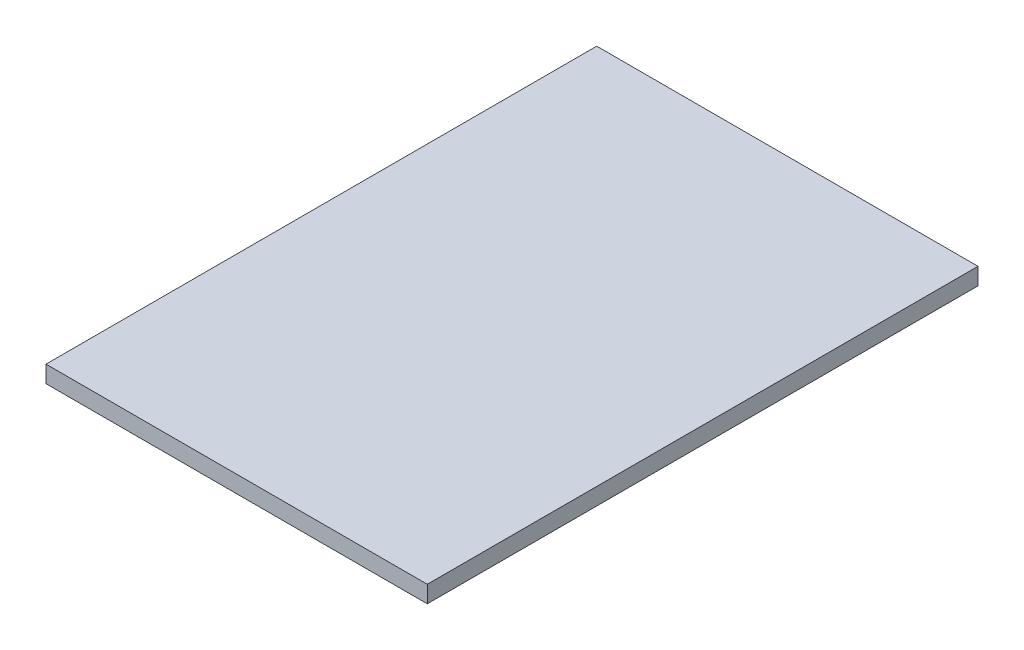
ISO-10303-21;
HEADER;
FILE_DESCRIPTION(('STEP AP214'),'2;1');
FILE_NAME('part.step','',(''),(''),'','','');
FILE_SCHEMA(('AUTOMOTIVE_DESIGN { 1 0 10303 214 1 1 1 1 }'));
ENDSEC;
DATA;
#1=APPLICATION_CONTEXT('core data for automotive mechanical design processes');
#2=APPLICATION_PROTOCOL_DEFINITION('international standard','automotive_design',2000,#1);
#3=PRODUCT_CONTEXT('',#1,'mechanical');
#4=PRODUCT('Part','Part','',(#3));
#5=PRODUCT_RELATED_PRODUCT_CATEGORY('part','',(#4));
#6=PRODUCT_DEFINITION_FORMATION('','',#4);
#7=PRODUCT_DEFINITION_CONTEXT('part definition',#1,'design');
#8=PRODUCT_DEFINITION('design','',#6,#7);
#9=PRODUCT_DEFINITION_SHAPE('','',#8);
#10=(LENGTH_UNIT() NAMED_UNIT(*) SI_UNIT(.MILLI.,.METRE.));
#11=(NAMED_UNIT(*) PLANE_ANGLE_UNIT() SI_UNIT($,.RADIAN.));
#12=(NAMED_UNIT(*) SI_UNIT($,.STERADIAN.) SOLID_ANGLE_UNIT());
#13=UNCERTAINTY_MEASURE_WITH_UNIT(LENGTH_MEASURE(1.E-05),#10,'distance_accuracy_value','');
#14=(GEOMETRIC_REPRESENTATION_CONTEXT(3) GLOBAL_UNCERTAINTY_ASSIGNED_CONTEXT((#13)) GLOBAL_UNIT_ASSIGNED_CONTEXT((#10,
#11,#12)) REPRESENTATION_CONTEXT('',''));
#15=CARTESIAN_POINT('',(0.,0.,0.));
#16=DIRECTION('',(0.,0.,1.));
#17=DIRECTION('',(1.,0.,0.));
#18=AXIS2_PLACEMENT_3D('',#15,#16,#17);
#19=CARTESIAN_POINT('',(225.,10.,325.));
#20=DIRECTION('',(-1.,0.,0.));
#21=DIRECTION('',(0.,0.,1.));
#22=AXIS2_PLACEMENT_3D('',#19,#20,#21);
#23=PLANE('',#22);
#24=DIRECTION('',(0.,0.,-1.));
#25=VECTOR('',#24,1.);
#26=CARTESIAN_POINT('',(225.,-10.,325.));
#27=LINE('',#26,#25);
#28=CARTESIAN_POINT('',(225.,-10.,325.));
#29=VERTEX_POINT('',#28);
#30=CARTESIAN_POINT('',(225.,-10.,-325.));
#31=VERTEX_POINT('',#30);
#32=EDGE_CURVE('E96',#29,#31,#27,.T.);
#33=ORIENTED_EDGE('',*,*,#32,.T.);
#34=DIRECTION('',(0.,-1.,0.));
#35=VECTOR('',#34,1.);
#36=CARTESIAN_POINT('',(225.,10.,-325.));
#37=LINE('',#36,#35);
#38=CARTESIAN_POINT('',(225.,10.,-325.));
#39=VERTEX_POINT('',#38);
#40=EDGE_CURVE('E11',#39,#31,#37,.T.);
#41=ORIENTED_EDGE('',*,*,#40,.F.);
#42=DIRECTION('',(0.,0.,-1.));
#43=VECTOR('',#42,1.);
#44=CARTESIAN_POINT('',(225.,10.,325.));
#45=LINE('',#44,#43);
#46=CARTESIAN_POINT('',(225.,10.,325.));
#47=VERTEX_POINT('',#46);
#48=EDGE_CURVE('E84',#47,#39,#45,.T.);
#49=ORIENTED_EDGE('',*,*,#48,.F.);
#50=DIRECTION('',(0.,-1.,0.));
#51=VECTOR('',#50,1.);
#52=CARTESIAN_POINT('',(225.,10.,325.));
#53=LINE('',#52,#51);
#54=EDGE_CURVE('E92',#47,#29,#53,.T.);
#55=ORIENTED_EDGE('',*,*,#54,.T.);
#56=EDGE_LOOP('',(#33,#41,#49,#55));
#57=FACE_BOUND('',#56,.T.);
#58=ADVANCED_FACE('F33',(#57),#23,.F.);
#59=CARTESIAN_POINT('',(-225.,10.,-325.));
#60=DIRECTION('',(0.,0.,1.));
#61=DIRECTION('',(1.,0.,0.));
#62=AXIS2_PLACEMENT_3D('',#59,#60,#61);
#63=PLANE('',#62);
#64=DIRECTION('',(-1.,0.,0.));
#65=VECTOR('',#64,1.);
#66=CARTESIAN_POINT('',(-225.,-10.,-325.));
#67=LINE('',#66,#65);
#68=CARTESIAN_POINT('',(-225.,-10.,-325.));
#69=VERTEX_POINT('',#68);
#70=EDGE_CURVE('E88',#31,#69,#67,.T.);
#71=ORIENTED_EDGE('',*,*,#70,.T.);
#72=DIRECTION('',(0.,-1.,0.));
#73=VECTOR('',#72,1.);
#74=CARTESIAN_POINT('',(-225.,10.,-325.));
#75=LINE('',#74,#73);
#76=CARTESIAN_POINT('',(-225.,10.,-325.));
#77=VERTEX_POINT('',#76);
#78=EDGE_CURVE('E41',#77,#69,#75,.T.);
#79=ORIENTED_EDGE('',*,*,#78,.F.);
#80=DIRECTION('',(-1.,0.,0.));
#81=VECTOR('',#80,1.);
#82=CARTESIAN_POINT('',(-225.,10.,-325.));
#83=LINE('',#82,#81);
#84=EDGE_CURVE('E79',#39,#77,#83,.T.);
#85=ORIENTED_EDGE('',*,*,#84,.F.);
#86=ORIENTED_EDGE('',*,*,#40,.T.);
#87=EDGE_LOOP('',(#71,#79,#85,#86));
#88=FACE_BOUND('',#87,.T.);
#89=ADVANCED_FACE('F87',(#88),#63,.F.);
#90=CARTESIAN_POINT('',(-225.,10.,325.));
#91=DIRECTION('',(1.,0.,0.));
#92=DIRECTION('',(0.,0.,-1.));
#93=AXIS2_PLACEMENT_3D('',#90,#91,#92);
#94=PLANE('',#93);
#95=DIRECTION('',(0.,0.,1.));
#96=VECTOR('',#95,1.);
#97=CARTESIAN_POINT('',(-225.,-10.,325.));
#98=LINE('',#97,#96);
#99=CARTESIAN_POINT('',(-225.,-10.,325.));
#100=VERTEX_POINT('',#99);
#101=EDGE_CURVE('E66',#69,#100,#98,.T.);
#102=ORIENTED_EDGE('',*,*,#101,.T.);
#103=DIRECTION('',(0.,-1.,0.));
#104=VECTOR('',#103,1.);
#105=CARTESIAN_POINT('',(-225.,10.,325.));
#106=LINE('',#105,#104);
#107=CARTESIAN_POINT('',(-225.,10.,325.));
#108=VERTEX_POINT('',#107);
#109=EDGE_CURVE('E89',#108,#100,#106,.T.);
#110=ORIENTED_EDGE('',*,*,#109,.F.);
#111=DIRECTION('',(0.,0.,1.));
#112=VECTOR('',#111,1.);
#113=CARTESIAN_POINT('',(-225.,10.,325.));
#114=LINE('',#113,#112);
#115=EDGE_CURVE('E82',#77,#108,#114,.T.);
#116=ORIENTED_EDGE('',*,*,#115,.F.);
#117=ORIENTED_EDGE('',*,*,#78,.T.);
#118=EDGE_LOOP('',(#102,#110,#116,#117));
#119=FACE_BOUND('',#118,.T.);
#120=ADVANCED_FACE('F90',(#119),#94,.F.);
#121=CARTESIAN_POINT('',(-225.,10.,325.));
#122=DIRECTION('',(0.,0.,-1.));
#123=DIRECTION('',(-1.,0.,0.));
#124=AXIS2_PLACEMENT_3D('',#121,#122,#123);
#125=PLANE('',#124);
#126=DIRECTION('',(1.,0.,0.));
#127=VECTOR('',#126,1.);
#128=CARTESIAN_POINT('',(-225.,-10.,325.));
#129=LINE('',#128,#127);
#130=EDGE_CURVE('E72',#100,#29,#129,.T.);
#131=ORIENTED_EDGE('',*,*,#130,.T.);
#132=ORIENTED_EDGE('',*,*,#54,.F.);
#133=DIRECTION('',(1.,0.,0.));
#134=VECTOR('',#133,1.);
#135=CARTESIAN_POINT('',(-225.,10.,325.));
#136=LINE('',#135,#134);
#137=EDGE_CURVE('E49',#108,#47,#136,.T.);
#138=ORIENTED_EDGE('',*,*,#137,.F.);
#139=ORIENTED_EDGE('',*,*,#109,.T.);
#140=EDGE_LOOP('',(#131,#132,#138,#139));
#141=FACE_BOUND('',#140,.T.);
#142=ADVANCED_FACE('F103',(#141),#125,.F.);
#143=CARTESIAN_POINT('',(0.,10.,0.));
#144=DIRECTION('',(0.,-1.,0.));
#145=DIRECTION('',(0.,0.,-1.));
#146=AXIS2_PLACEMENT_3D('',#143,#144,#145);
#147=PLANE('',#146);
#148=ORIENTED_EDGE('',*,*,#48,.T.);
#149=ORIENTED_EDGE('',*,*,#84,.T.);
#150=ORIENTED_EDGE('',*,*,#115,.T.);
#151=ORIENTED_EDGE('',*,*,#137,.T.);
#152=EDGE_LOOP('',(#148,#149,#150,#151));
#153=FACE_BOUND('',#152,.T.);
#154=ADVANCED_FACE('F80',(#153),#147,.F.);
#155=CARTESIAN_POINT('',(0.,-10.,0.));
#156=DIRECTION('',(0.,-1.,0.));
#157=DIRECTION('',(0.,0.,-1.));
#158=AXIS2_PLACEMENT_3D('',#155,#156,#157);
#159=PLANE('',#158);
#160=ORIENTED_EDGE('',*,*,#32,.F.);
#161=ORIENTED_EDGE('',*,*,#130,.F.);
#162=ORIENTED_EDGE('',*,*,#101,.F.);
#163=ORIENTED_EDGE('',*,*,#70,.F.);
#164=EDGE_LOOP('',(#160,#161,#162,#163));
#165=FACE_BOUND('',#164,.T.);
#166=ADVANCED_FACE('F106',(#165),#159,.T.);
#167=CLOSED_SHELL('',(#58,#89,#120,#142,#154,#166));
#168=MANIFOLD_SOLID_BREP('B2',#167);
#169=ADVANCED_BREP_SHAPE_REPRESENTATION('',(#18,#168),#14);
#170=SHAPE_DEFINITION_REPRESENTATION(#9,#169);
ENDSEC;
END-ISO-10303-21;
